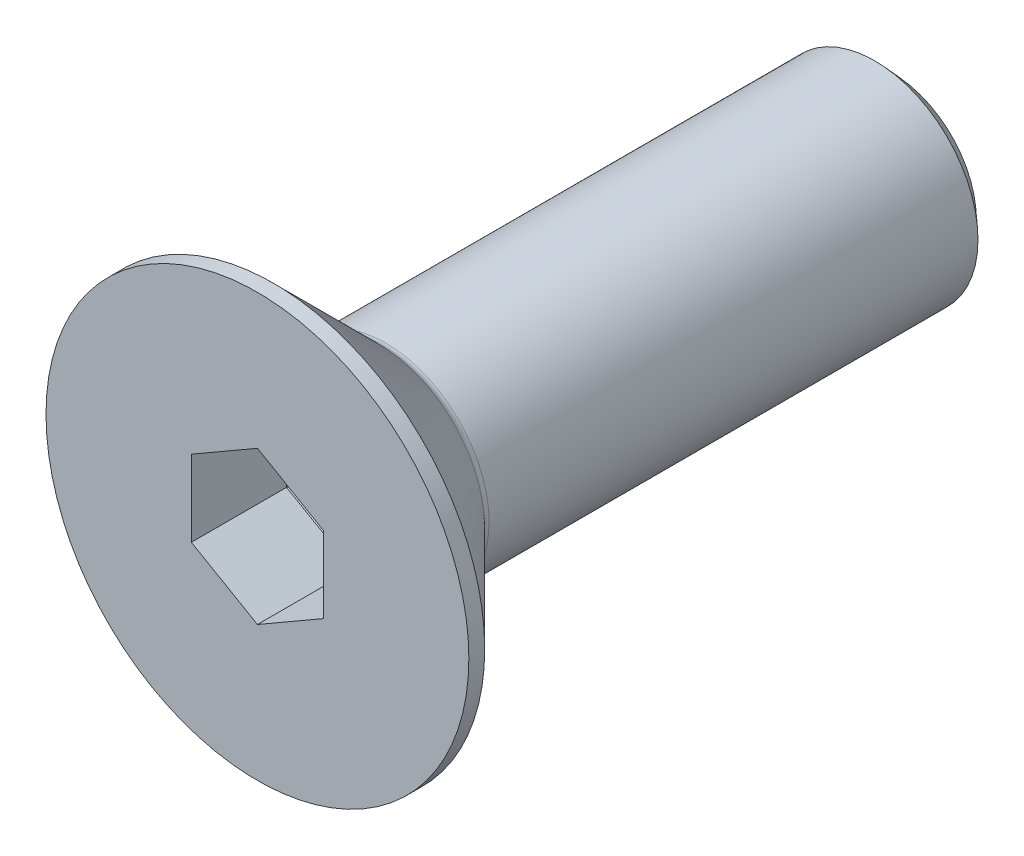
ISO-10303-21;
HEADER;
FILE_DESCRIPTION(('STEP AP214'),'2;1');
FILE_NAME('part.step','',(''),(''),'','','');
FILE_SCHEMA(('AUTOMOTIVE_DESIGN { 1 0 10303 214 1 1 1 1 }'));
ENDSEC;
DATA;
#1=APPLICATION_CONTEXT('core data for automotive mechanical design processes');
#2=APPLICATION_PROTOCOL_DEFINITION('international standard','automotive_design',2000,#1);
#3=PRODUCT_CONTEXT('',#1,'mechanical');
#4=PRODUCT('Part','Part','',(#3));
#5=PRODUCT_RELATED_PRODUCT_CATEGORY('part','',(#4));
#6=PRODUCT_DEFINITION_FORMATION('','',#4);
#7=PRODUCT_DEFINITION_CONTEXT('part definition',#1,'design');
#8=PRODUCT_DEFINITION('design','',#6,#7);
#9=PRODUCT_DEFINITION_SHAPE('','',#8);
#10=(LENGTH_UNIT() NAMED_UNIT(*) SI_UNIT(.MILLI.,.METRE.));
#11=(NAMED_UNIT(*) PLANE_ANGLE_UNIT() SI_UNIT($,.RADIAN.));
#12=(NAMED_UNIT(*) SI_UNIT($,.STERADIAN.) SOLID_ANGLE_UNIT());
#13=UNCERTAINTY_MEASURE_WITH_UNIT(LENGTH_MEASURE(1.E-05),#10,'distance_accuracy_value','');
#14=(GEOMETRIC_REPRESENTATION_CONTEXT(3) GLOBAL_UNCERTAINTY_ASSIGNED_CONTEXT((#13)) GLOBAL_UNIT_ASSIGNED_CONTEXT((#10,
#11,#12)) REPRESENTATION_CONTEXT('',''));
#15=CARTESIAN_POINT('',(0.,0.,0.));
#16=DIRECTION('',(0.,0.,1.));
#17=DIRECTION('',(1.,0.,0.));
#18=AXIS2_PLACEMENT_3D('',#15,#16,#17);
#19=CARTESIAN_POINT('',(0.,0.,-7.70000000000014));
#20=DIRECTION('',(0.,0.,-1.));
#21=DIRECTION('',(0.,-1.,0.));
#22=AXIS2_PLACEMENT_3D('',#19,#20,#21);
#23=PLANE('',#22);
#24=CARTESIAN_POINT('',(0.,0.,-7.70000000000014));
#25=DIRECTION('',(0.,0.,-1.));
#26=DIRECTION('',(-1.,0.,0.));
#27=AXIS2_PLACEMENT_3D('',#24,#25,#26);
#28=CIRCLE('',#27,1.6);
#29=CARTESIAN_POINT('',(1.6,0.,-7.70000000000014));
#30=VERTEX_POINT('',#29);
#31=EDGE_CURVE('E266',#30,#30,#28,.T.);
#32=ORIENTED_EDGE('',*,*,#31,.T.);
#33=EDGE_LOOP('',(#32));
#34=FACE_BOUND('',#33,.T.);
#35=ADVANCED_FACE('F17',(#34),#23,.T.);
#36=CARTESIAN_POINT('',(0.,0.,4.14999999999976));
#37=DIRECTION('',(0.,0.,-1.));
#38=DIRECTION('',(-1.,0.,0.));
#39=AXIS2_PLACEMENT_3D('',#36,#37,#38);
#40=CYLINDRICAL_SURFACE('',#39,4.);
#41=CARTESIAN_POINT('',(0.,0.,3.99999999999966));
#42=DIRECTION('',(0.,0.,-1.));
#43=DIRECTION('',(1.,0.,0.));
#44=AXIS2_PLACEMENT_3D('',#41,#42,#43);
#45=CIRCLE('',#44,4.);
#46=CARTESIAN_POINT('',(4.,0.,3.99999999999966));
#47=VERTEX_POINT('',#46);
#48=EDGE_CURVE('E245',#47,#47,#45,.T.);
#49=ORIENTED_EDGE('',*,*,#48,.F.);
#50=DIRECTION('',(0.,0.,1.));
#51=VECTOR('',#50,1.);
#52=CARTESIAN_POINT('',(4.,0.,4.14999999999976));
#53=LINE('',#52,#51);
#54=CARTESIAN_POINT('',(4.,0.,4.29999999999987));
#55=VERTEX_POINT('',#54);
#56=EDGE_CURVE('E11',#47,#55,#53,.T.);
#57=ORIENTED_EDGE('',*,*,#56,.T.);
#58=CARTESIAN_POINT('',(0.,0.,4.29999999999986));
#59=DIRECTION('',(0.,0.,-1.));
#60=DIRECTION('',(1.,0.,0.));
#61=AXIS2_PLACEMENT_3D('',#58,#59,#60);
#62=CIRCLE('',#61,4.);
#63=EDGE_CURVE('E21',#55,#55,#62,.T.);
#64=ORIENTED_EDGE('',*,*,#63,.T.);
#65=ORIENTED_EDGE('',*,*,#56,.F.);
#66=EDGE_LOOP('',(#49,#57,#64,#65));
#67=FACE_BOUND('',#66,.T.);
#68=ADVANCED_FACE('F19',(#67),#40,.T.);
#69=CARTESIAN_POINT('',(-4.,0.,4.29999999999987));
#70=DIRECTION('',(0.,0.,1.));
#71=DIRECTION('',(1.,0.,0.));
#72=AXIS2_PLACEMENT_3D('',#69,#70,#71);
#73=PLANE('',#72);
#74=DIRECTION('',(0.866025403784439,-0.5,0.));
#75=VECTOR('',#74,1.);
#76=CARTESIAN_POINT('',(-1.1875,2.12897911763674,4.29999999999987));
#77=LINE('',#76,#75);
#78=CARTESIAN_POINT('',(0.,1.44337567297406,4.29999999999987));
#79=VERTEX_POINT('',#78);
#80=CARTESIAN_POINT('',(1.25,0.721687836487032,4.29999999999987));
#81=VERTEX_POINT('',#80);
#82=EDGE_CURVE('E119',#79,#81,#77,.T.);
#83=ORIENTED_EDGE('',*,*,#82,.T.);
#84=DIRECTION('',(0.,-1.,0.));
#85=VECTOR('',#84,1.);
#86=CARTESIAN_POINT('',(1.25,0.360843918243516,4.29999999999987));
#87=LINE('',#86,#85);
#88=CARTESIAN_POINT('',(1.25,-0.721687836487033,4.29999999999987));
#89=VERTEX_POINT('',#88);
#90=EDGE_CURVE('E46',#81,#89,#87,.T.);
#91=ORIENTED_EDGE('',*,*,#90,.T.);
#92=DIRECTION('',(-0.866025403784439,-0.5,0.));
#93=VECTOR('',#92,1.);
#94=CARTESIAN_POINT('',(-0.562500000000007,-1.76813519939323,4.29999999999987));
#95=LINE('',#94,#93);
#96=CARTESIAN_POINT('',(0.,-1.44337567297406,4.29999999999987));
#97=VERTEX_POINT('',#96);
#98=EDGE_CURVE('E166',#89,#97,#95,.T.);
#99=ORIENTED_EDGE('',*,*,#98,.T.);
#100=DIRECTION('',(-0.866025403784439,0.5,0.));
#101=VECTOR('',#100,1.);
#102=CARTESIAN_POINT('',(-1.8125,-0.396928310067868,4.29999999999987));
#103=LINE('',#102,#101);
#104=CARTESIAN_POINT('',(-1.25,-0.721687836487031,4.29999999999987));
#105=VERTEX_POINT('',#104);
#106=EDGE_CURVE('E162',#97,#105,#103,.T.);
#107=ORIENTED_EDGE('',*,*,#106,.T.);
#108=DIRECTION('',(0.,1.,0.));
#109=VECTOR('',#108,1.);
#110=CARTESIAN_POINT('',(-1.25,-0.360843918243516,4.29999999999987));
#111=LINE('',#110,#109);
#112=CARTESIAN_POINT('',(-1.25,0.721687836487032,4.29999999999987));
#113=VERTEX_POINT('',#112);
#114=EDGE_CURVE('E121',#105,#113,#111,.T.);
#115=ORIENTED_EDGE('',*,*,#114,.T.);
#116=DIRECTION('',(0.866025403784439,0.5,0.));
#117=VECTOR('',#116,1.);
#118=CARTESIAN_POINT('',(-2.4375,0.0360843918243526,4.29999999999987));
#119=LINE('',#118,#117);
#120=EDGE_CURVE('E114',#113,#79,#119,.T.);
#121=ORIENTED_EDGE('',*,*,#120,.T.);
#122=EDGE_LOOP('',(#83,#91,#99,#107,#115,#121));
#123=FACE_BOUND('',#122,.T.);
#124=ORIENTED_EDGE('',*,*,#63,.F.);
#125=EDGE_LOOP('',(#124));
#126=FACE_BOUND('',#125,.T.);
#127=ADVANCED_FACE('F116',(#123,#126),#73,.T.);
#128=CARTESIAN_POINT('',(1.25,0.721687836487032,4.29999999999987));
#129=DIRECTION('',(1.,0.,0.));
#130=DIRECTION('',(0.,0.,1.));
#131=AXIS2_PLACEMENT_3D('',#128,#129,#130);
#132=PLANE('',#131);
#133=ORIENTED_EDGE('',*,*,#90,.F.);
#134=DIRECTION('',(0.,0.,-1.));
#135=VECTOR('',#134,1.);
#136=CARTESIAN_POINT('',(1.25,0.721687836487032,4.29999999999987));
#137=LINE('',#136,#135);
#138=CARTESIAN_POINT('',(1.25,0.721687836487032,2.49999999999987));
#139=VERTEX_POINT('',#138);
#140=EDGE_CURVE('E126',#81,#139,#137,.T.);
#141=ORIENTED_EDGE('',*,*,#140,.T.);
#142=DIRECTION('',(0.,-1.,0.));
#143=VECTOR('',#142,1.);
#144=CARTESIAN_POINT('',(1.25,0.721687836487032,2.49999999999987));
#145=LINE('',#144,#143);
#146=CARTESIAN_POINT('',(1.25,-0.721687836487033,2.49999999999987));
#147=VERTEX_POINT('',#146);
#148=EDGE_CURVE('E141',#139,#147,#145,.T.);
#149=ORIENTED_EDGE('',*,*,#148,.T.);
#150=DIRECTION('',(0.,0.,-1.));
#151=VECTOR('',#150,1.);
#152=CARTESIAN_POINT('',(1.25,-0.721687836487033,4.29999999999987));
#153=LINE('',#152,#151);
#154=EDGE_CURVE('E168',#89,#147,#153,.T.);
#155=ORIENTED_EDGE('',*,*,#154,.F.);
#156=EDGE_LOOP('',(#133,#141,#149,#155));
#157=FACE_BOUND('',#156,.T.);
#158=ADVANCED_FACE('F289',(#157),#132,.F.);
#159=CARTESIAN_POINT('',(1.25,-0.721687836487033,4.29999999999987));
#160=DIRECTION('',(0.5,-0.866025403784439,0.));
#161=DIRECTION('',(0.,0.,-1.));
#162=AXIS2_PLACEMENT_3D('',#159,#160,#161);
#163=PLANE('',#162);
#164=ORIENTED_EDGE('',*,*,#98,.F.);
#165=ORIENTED_EDGE('',*,*,#154,.T.);
#166=DIRECTION('',(-0.866025403784439,-0.5,0.));
#167=VECTOR('',#166,1.);
#168=CARTESIAN_POINT('',(1.25,-0.721687836487033,2.49999999999987));
#169=LINE('',#168,#167);
#170=CARTESIAN_POINT('',(0.,-1.44337567297406,2.49999999999987));
#171=VERTEX_POINT('',#170);
#172=EDGE_CURVE('E203',#147,#171,#169,.T.);
#173=ORIENTED_EDGE('',*,*,#172,.T.);
#174=DIRECTION('',(0.,0.,-1.));
#175=VECTOR('',#174,1.);
#176=CARTESIAN_POINT('',(0.,-1.44337567297406,4.29999999999987));
#177=LINE('',#176,#175);
#178=EDGE_CURVE('E163',#97,#171,#177,.T.);
#179=ORIENTED_EDGE('',*,*,#178,.F.);
#180=EDGE_LOOP('',(#164,#165,#173,#179));
#181=FACE_BOUND('',#180,.T.);
#182=ADVANCED_FACE('F296',(#181),#163,.F.);
#183=CARTESIAN_POINT('',(0.,-1.44337567297406,4.29999999999987));
#184=DIRECTION('',(-0.5,-0.866025403784439,0.));
#185=DIRECTION('',(-0.866025403784439,0.5,0.));
#186=AXIS2_PLACEMENT_3D('',#183,#184,#185);
#187=PLANE('',#186);
#188=ORIENTED_EDGE('',*,*,#106,.F.);
#189=ORIENTED_EDGE('',*,*,#178,.T.);
#190=DIRECTION('',(-0.866025403784439,0.5,0.));
#191=VECTOR('',#190,1.);
#192=CARTESIAN_POINT('',(0.,-1.44337567297406,2.49999999999987));
#193=LINE('',#192,#191);
#194=CARTESIAN_POINT('',(-1.25,-0.721687836487031,2.49999999999987));
#195=VERTEX_POINT('',#194);
#196=EDGE_CURVE('E195',#171,#195,#193,.T.);
#197=ORIENTED_EDGE('',*,*,#196,.T.);
#198=DIRECTION('',(0.,0.,-1.));
#199=VECTOR('',#198,1.);
#200=CARTESIAN_POINT('',(-1.25,-0.721687836487031,4.29999999999987));
#201=LINE('',#200,#199);
#202=EDGE_CURVE('E159',#105,#195,#201,.T.);
#203=ORIENTED_EDGE('',*,*,#202,.F.);
#204=EDGE_LOOP('',(#188,#189,#197,#203));
#205=FACE_BOUND('',#204,.T.);
#206=ADVANCED_FACE('F308',(#205),#187,.F.);
#207=CARTESIAN_POINT('',(-1.25,-0.721687836487031,4.29999999999987));
#208=DIRECTION('',(-1.,0.,0.));
#209=DIRECTION('',(0.,0.,1.));
#210=AXIS2_PLACEMENT_3D('',#207,#208,#209);
#211=PLANE('',#210);
#212=ORIENTED_EDGE('',*,*,#114,.F.);
#213=ORIENTED_EDGE('',*,*,#202,.T.);
#214=DIRECTION('',(0.,1.,0.));
#215=VECTOR('',#214,1.);
#216=CARTESIAN_POINT('',(-1.25,-0.721687836487032,2.49999999999987));
#217=LINE('',#216,#215);
#218=CARTESIAN_POINT('',(-1.25,0.721687836487032,2.49999999999987));
#219=VERTEX_POINT('',#218);
#220=EDGE_CURVE('E194',#195,#219,#217,.T.);
#221=ORIENTED_EDGE('',*,*,#220,.T.);
#222=DIRECTION('',(0.,0.,-1.));
#223=VECTOR('',#222,1.);
#224=CARTESIAN_POINT('',(-1.25,0.721687836487032,4.29999999999987));
#225=LINE('',#224,#223);
#226=EDGE_CURVE('E125',#113,#219,#225,.T.);
#227=ORIENTED_EDGE('',*,*,#226,.F.);
#228=EDGE_LOOP('',(#212,#213,#221,#227));
#229=FACE_BOUND('',#228,.T.);
#230=ADVANCED_FACE('F309',(#229),#211,.F.);
#231=CARTESIAN_POINT('',(-1.25,0.721687836487032,4.29999999999987));
#232=DIRECTION('',(-0.5,0.866025403784439,0.));
#233=DIRECTION('',(0.,0.,1.));
#234=AXIS2_PLACEMENT_3D('',#231,#232,#233);
#235=PLANE('',#234);
#236=ORIENTED_EDGE('',*,*,#120,.F.);
#237=ORIENTED_EDGE('',*,*,#226,.T.);
#238=DIRECTION('',(0.866025403784439,0.5,0.));
#239=VECTOR('',#238,1.);
#240=CARTESIAN_POINT('',(-1.25,0.721687836487032,2.49999999999987));
#241=LINE('',#240,#239);
#242=CARTESIAN_POINT('',(0.,1.44337567297406,2.49999999999987));
#243=VERTEX_POINT('',#242);
#244=EDGE_CURVE('E132',#219,#243,#241,.T.);
#245=ORIENTED_EDGE('',*,*,#244,.T.);
#246=DIRECTION('',(0.,0.,-1.));
#247=VECTOR('',#246,1.);
#248=CARTESIAN_POINT('',(0.,1.44337567297406,4.29999999999987));
#249=LINE('',#248,#247);
#250=EDGE_CURVE('E129',#79,#243,#249,.T.);
#251=ORIENTED_EDGE('',*,*,#250,.F.);
#252=EDGE_LOOP('',(#236,#237,#245,#251));
#253=FACE_BOUND('',#252,.T.);
#254=ADVANCED_FACE('F130',(#253),#235,.F.);
#255=CARTESIAN_POINT('',(0.,1.44337567297406,4.29999999999987));
#256=DIRECTION('',(0.5,0.866025403784439,0.));
#257=DIRECTION('',(0.,0.,-1.));
#258=AXIS2_PLACEMENT_3D('',#255,#256,#257);
#259=PLANE('',#258);
#260=ORIENTED_EDGE('',*,*,#82,.F.);
#261=ORIENTED_EDGE('',*,*,#250,.T.);
#262=DIRECTION('',(0.866025403784439,-0.5,0.));
#263=VECTOR('',#262,1.);
#264=CARTESIAN_POINT('',(0.,1.44337567297406,2.49999999999987));
#265=LINE('',#264,#263);
#266=EDGE_CURVE('E182',#243,#139,#265,.T.);
#267=ORIENTED_EDGE('',*,*,#266,.T.);
#268=ORIENTED_EDGE('',*,*,#140,.F.);
#269=EDGE_LOOP('',(#260,#261,#267,#268));
#270=FACE_BOUND('',#269,.T.);
#271=ADVANCED_FACE('F139',(#270),#259,.F.);
#272=CARTESIAN_POINT('',(1.25,-0.721687836487033,2.49999999999987));
#273=DIRECTION('',(0.5,0.,-0.866025403784439));
#274=DIRECTION('',(0.,-1.,0.));
#275=AXIS2_PLACEMENT_3D('',#272,#273,#274);
#276=PLANE('',#275);
#277=DIRECTION('',(-0.774596669241483,0.447213595499958,-0.447213595499958));
#278=VECTOR('',#277,1.);
#279=CARTESIAN_POINT('',(1.,-0.577350269189627,2.35566243270246));
#280=LINE('',#279,#278);
#281=CARTESIAN_POINT('',(0.,0.,1.77831216351283));
#282=VERTEX_POINT('',#281);
#283=EDGE_CURVE('E148',#147,#282,#280,.T.);
#284=ORIENTED_EDGE('',*,*,#283,.F.);
#285=ORIENTED_EDGE('',*,*,#148,.F.);
#286=DIRECTION('',(-0.774596669241483,-0.447213595499958,-0.447213595499958));
#287=VECTOR('',#286,1.);
#288=CARTESIAN_POINT('',(1.,0.577350269189626,2.35566243270246));
#289=LINE('',#288,#287);
#290=EDGE_CURVE('E237',#139,#282,#289,.T.);
#291=ORIENTED_EDGE('',*,*,#290,.T.);
#292=EDGE_LOOP('',(#284,#285,#291));
#293=FACE_BOUND('',#292,.T.);
#294=ADVANCED_FACE('F238',(#293),#276,.F.);
#295=CARTESIAN_POINT('',(0.,-1.44337567297406,2.49999999999987));
#296=DIRECTION('',(0.25,-0.43301270189222,-0.866025403784439));
#297=DIRECTION('',(0.,-0.894427190999916,0.447213595499959));
#298=AXIS2_PLACEMENT_3D('',#295,#296,#297);
#299=PLANE('',#298);
#300=DIRECTION('',(0.,0.894427190999916,-0.447213595499958));
#301=VECTOR('',#300,1.);
#302=CARTESIAN_POINT('',(0.,-1.15470053837925,2.35566243270246));
#303=LINE('',#302,#301);
#304=EDGE_CURVE('E199',#171,#282,#303,.T.);
#305=ORIENTED_EDGE('',*,*,#304,.F.);
#306=ORIENTED_EDGE('',*,*,#172,.F.);
#307=ORIENTED_EDGE('',*,*,#283,.T.);
#308=EDGE_LOOP('',(#305,#306,#307));
#309=FACE_BOUND('',#308,.T.);
#310=ADVANCED_FACE('F215',(#309),#299,.F.);
#311=CARTESIAN_POINT('',(-1.25,-0.721687836487031,2.49999999999987));
#312=DIRECTION('',(-0.25,-0.433012701892219,-0.866025403784439));
#313=DIRECTION('',(0.,-0.894427190999916,0.447213595499958));
#314=AXIS2_PLACEMENT_3D('',#311,#312,#313);
#315=PLANE('',#314);
#316=DIRECTION('',(0.774596669241484,0.447213595499958,-0.447213595499958));
#317=VECTOR('',#316,1.);
#318=CARTESIAN_POINT('',(-1.,-0.577350269189626,2.35566243270246));
#319=LINE('',#318,#317);
#320=EDGE_CURVE('E200',#195,#282,#319,.T.);
#321=ORIENTED_EDGE('',*,*,#320,.F.);
#322=ORIENTED_EDGE('',*,*,#196,.F.);
#323=ORIENTED_EDGE('',*,*,#304,.T.);
#324=EDGE_LOOP('',(#321,#322,#323));
#325=FACE_BOUND('',#324,.T.);
#326=ADVANCED_FACE('F223',(#325),#315,.F.);
#327=CARTESIAN_POINT('',(-1.25,0.721687836487032,2.49999999999987));
#328=DIRECTION('',(-0.5,0.,-0.866025403784439));
#329=DIRECTION('',(-0.866025403784439,0.,0.5));
#330=AXIS2_PLACEMENT_3D('',#327,#328,#329);
#331=PLANE('',#330);
#332=DIRECTION('',(0.774596669241483,-0.447213595499958,-0.447213595499958));
#333=VECTOR('',#332,1.);
#334=CARTESIAN_POINT('',(-1.,0.577350269189626,2.35566243270246));
#335=LINE('',#334,#333);
#336=EDGE_CURVE('E190',#219,#282,#335,.T.);
#337=ORIENTED_EDGE('',*,*,#336,.F.);
#338=ORIENTED_EDGE('',*,*,#220,.F.);
#339=ORIENTED_EDGE('',*,*,#320,.T.);
#340=EDGE_LOOP('',(#337,#338,#339));
#341=FACE_BOUND('',#340,.T.);
#342=ADVANCED_FACE('F227',(#341),#331,.F.);
#343=CARTESIAN_POINT('',(0.,1.44337567297406,2.49999999999987));
#344=DIRECTION('',(-0.25,0.433012701892219,-0.866025403784439));
#345=DIRECTION('',(-0.960768922830523,0.,0.277350098112614));
#346=AXIS2_PLACEMENT_3D('',#343,#344,#345);
#347=PLANE('',#346);
#348=DIRECTION('',(0.,-0.894427190999916,-0.447213595499958));
#349=VECTOR('',#348,1.);
#350=CARTESIAN_POINT('',(0.,1.15470053837925,2.35566243270246));
#351=LINE('',#350,#349);
#352=EDGE_CURVE('E184',#243,#282,#351,.T.);
#353=ORIENTED_EDGE('',*,*,#352,.F.);
#354=ORIENTED_EDGE('',*,*,#244,.F.);
#355=ORIENTED_EDGE('',*,*,#336,.T.);
#356=EDGE_LOOP('',(#353,#354,#355));
#357=FACE_BOUND('',#356,.T.);
#358=ADVANCED_FACE('F232',(#357),#347,.F.);
#359=CARTESIAN_POINT('',(1.25,0.721687836487032,2.49999999999987));
#360=DIRECTION('',(0.25,0.433012701892219,-0.866025403784439));
#361=DIRECTION('',(-0.960768922830523,0.,-0.277350098112614));
#362=AXIS2_PLACEMENT_3D('',#359,#360,#361);
#363=PLANE('',#362);
#364=ORIENTED_EDGE('',*,*,#290,.F.);
#365=ORIENTED_EDGE('',*,*,#266,.F.);
#366=ORIENTED_EDGE('',*,*,#352,.T.);
#367=EDGE_LOOP('',(#364,#365,#366));
#368=FACE_BOUND('',#367,.T.);
#369=ADVANCED_FACE('F236',(#368),#363,.F.);
#370=CARTESIAN_POINT('',(0.,0.,-2.85000000000013));
#371=DIRECTION('',(0.,0.,-1.));
#372=DIRECTION('',(-1.,0.,0.));
#373=AXIS2_PLACEMENT_3D('',#370,#371,#372);
#374=CYLINDRICAL_SURFACE('',#373,1.954);
#375=CARTESIAN_POINT('',(0.,0.,-7.37818181818196));
#376=DIRECTION('',(0.,0.,1.));
#377=DIRECTION('',(-1.,0.,0.));
#378=AXIS2_PLACEMENT_3D('',#375,#376,#377);
#379=CIRCLE('',#378,1.954);
#380=CARTESIAN_POINT('',(1.954,0.,-7.37818181818196));
#381=VERTEX_POINT('',#380);
#382=EDGE_CURVE('E274',#381,#381,#379,.T.);
#383=ORIENTED_EDGE('',*,*,#382,.T.);
#384=DIRECTION('',(0.,0.,1.));
#385=VECTOR('',#384,1.);
#386=CARTESIAN_POINT('',(1.954,0.,-2.85000000000013));
#387=LINE('',#386,#385);
#388=CARTESIAN_POINT('',(1.954,0.,1.87115728752521));
#389=VERTEX_POINT('',#388);
#390=EDGE_CURVE('E240',#381,#389,#387,.T.);
#391=ORIENTED_EDGE('',*,*,#390,.T.);
#392=CARTESIAN_POINT('',(0.,0.,1.87115728752521));
#393=DIRECTION('',(0.,0.,1.));
#394=DIRECTION('',(-1.,0.,0.));
#395=AXIS2_PLACEMENT_3D('',#392,#393,#394);
#396=CIRCLE('',#395,1.954);
#397=EDGE_CURVE('E252',#389,#389,#396,.T.);
#398=ORIENTED_EDGE('',*,*,#397,.F.);
#399=ORIENTED_EDGE('',*,*,#390,.F.);
#400=EDGE_LOOP('',(#383,#391,#398,#399));
#401=FACE_BOUND('',#400,.T.);
#402=ADVANCED_FACE('F330',(#401),#374,.T.);
#403=CARTESIAN_POINT('',(0.,0.,2.99999999999976));
#404=DIRECTION('',(0.,0.,1.));
#405=DIRECTION('',(-1.,0.,0.));
#406=AXIS2_PLACEMENT_3D('',#403,#404,#405);
#407=CONICAL_SURFACE('',#406,3.,0.78539816339749);
#408=CARTESIAN_POINT('',(0.,0.,2.01257864376253));
#409=DIRECTION('',(0.,0.,-1.));
#410=DIRECTION('',(-1.,0.,0.));
#411=AXIS2_PLACEMENT_3D('',#408,#409,#410);
#412=CIRCLE('',#411,2.0125786437627);
#413=CARTESIAN_POINT('',(2.0125786437627,0.,2.01257864376253));
#414=VERTEX_POINT('',#413);
#415=EDGE_CURVE('E257',#414,#414,#412,.T.);
#416=ORIENTED_EDGE('',*,*,#415,.F.);
#417=DIRECTION('',(0.707106781186577,0.,0.707106781186518));
#418=VECTOR('',#417,1.);
#419=CARTESIAN_POINT('',(3.,0.,2.99999999999976));
#420=LINE('',#419,#418);
#421=EDGE_CURVE('E248',#414,#47,#420,.T.);
#422=ORIENTED_EDGE('',*,*,#421,.T.);
#423=ORIENTED_EDGE('',*,*,#48,.T.);
#424=ORIENTED_EDGE('',*,*,#421,.F.);
#425=EDGE_LOOP('',(#416,#422,#423,#424));
#426=FACE_BOUND('',#425,.T.);
#427=ADVANCED_FACE('F285',(#426),#407,.T.);
#428=CARTESIAN_POINT('',(0.,0.,1.87115728752521));
#429=DIRECTION('',(0.,0.,-1.));
#430=DIRECTION('',(-1.,0.,0.));
#431=AXIS2_PLACEMENT_3D('',#428,#429,#430);
#432=TOROIDAL_SURFACE('',#431,2.154,0.2);
#433=ORIENTED_EDGE('',*,*,#415,.T.);
#434=CARTESIAN_POINT('',(2.154,0.,1.87115728752521));
#435=DIRECTION('',(0.,-1.,0.));
#436=DIRECTION('',(1.,0.,0.));
#437=AXIS2_PLACEMENT_3D('',#434,#435,#436);
#438=CIRCLE('',#437,0.2);
#439=EDGE_CURVE('E253',#414,#389,#438,.T.);
#440=ORIENTED_EDGE('',*,*,#439,.T.);
#441=ORIENTED_EDGE('',*,*,#397,.T.);
#442=ORIENTED_EDGE('',*,*,#439,.F.);
#443=EDGE_LOOP('',(#433,#440,#441,#442));
#444=FACE_BOUND('',#443,.T.);
#445=ADVANCED_FACE('F336',(#444),#432,.F.);
#446=CARTESIAN_POINT('',(0.,0.,-7.50000000000014));
#447=DIRECTION('',(0.,0.,1.));
#448=DIRECTION('',(-1.,0.,0.));
#449=AXIS2_PLACEMENT_3D('',#446,#447,#448);
#450=CONICAL_SURFACE('',#449,1.82,0.83298126667444);
#451=ORIENTED_EDGE('',*,*,#382,.F.);
#452=DIRECTION('',(-0.739940073395949,0.,-0.672672793996307));
#453=VECTOR('',#452,1.);
#454=CARTESIAN_POINT('',(1.82,0.,-7.50000000000014));
#455=LINE('',#454,#453);
#456=EDGE_CURVE('E269',#381,#30,#455,.T.);
#457=ORIENTED_EDGE('',*,*,#456,.T.);
#458=ORIENTED_EDGE('',*,*,#31,.F.);
#459=ORIENTED_EDGE('',*,*,#456,.F.);
#460=EDGE_LOOP('',(#451,#457,#458,#459));
#461=FACE_BOUND('',#460,.T.);
#462=ADVANCED_FACE('F341',(#461),#450,.T.);
#463=CLOSED_SHELL('',(#35,#68,#127,#158,#182,#206,#230,#254,#271,#294,#310,#326,#342,#358,#369,
#402,#427,#445,#462));
#464=MANIFOLD_SOLID_BREP('B1',#463);
#465=ADVANCED_BREP_SHAPE_REPRESENTATION('',(#18,#464),#14);
#466=SHAPE_DEFINITION_REPRESENTATION(#9,#465);
ENDSEC;
END-ISO-10303-21;
